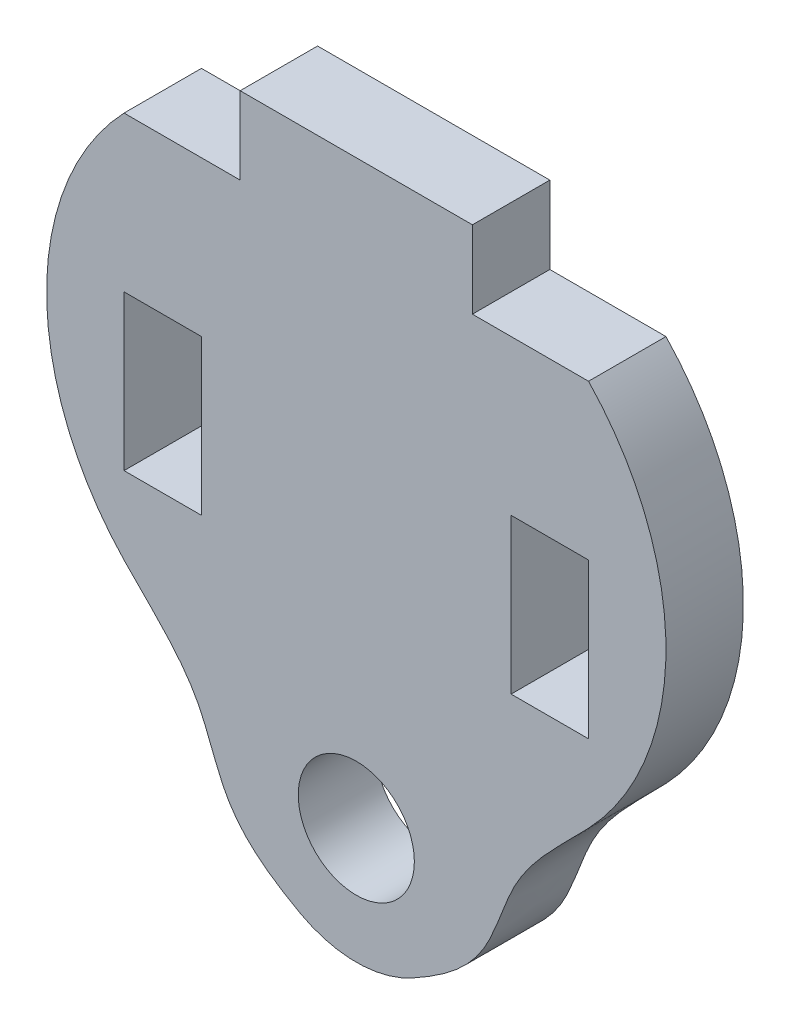
ISO-10303-21;
HEADER;
FILE_DESCRIPTION(('STEP AP214'),'2;1');
FILE_NAME('part.step','',(''),(''),'','','');
FILE_SCHEMA(('AUTOMOTIVE_DESIGN { 1 0 10303 214 1 1 1 1 }'));
ENDSEC;
DATA;
#1=APPLICATION_CONTEXT('core data for automotive mechanical design processes');
#2=APPLICATION_PROTOCOL_DEFINITION('international standard','automotive_design',2000,#1);
#3=PRODUCT_CONTEXT('',#1,'mechanical');
#4=PRODUCT('Part','Part','',(#3));
#5=PRODUCT_RELATED_PRODUCT_CATEGORY('part','',(#4));
#6=PRODUCT_DEFINITION_FORMATION('','',#4);
#7=PRODUCT_DEFINITION_CONTEXT('part definition',#1,'design');
#8=PRODUCT_DEFINITION('design','',#6,#7);
#9=PRODUCT_DEFINITION_SHAPE('','',#8);
#10=(LENGTH_UNIT() NAMED_UNIT(*) SI_UNIT(.MILLI.,.METRE.));
#11=(NAMED_UNIT(*) PLANE_ANGLE_UNIT() SI_UNIT($,.RADIAN.));
#12=(NAMED_UNIT(*) SI_UNIT($,.STERADIAN.) SOLID_ANGLE_UNIT());
#13=UNCERTAINTY_MEASURE_WITH_UNIT(LENGTH_MEASURE(1.E-05),#10,'distance_accuracy_value','');
#14=(GEOMETRIC_REPRESENTATION_CONTEXT(3) GLOBAL_UNCERTAINTY_ASSIGNED_CONTEXT((#13)) GLOBAL_UNIT_ASSIGNED_CONTEXT((#10,
#11,#12)) REPRESENTATION_CONTEXT('',''));
#15=CARTESIAN_POINT('',(0.,0.,0.));
#16=DIRECTION('',(0.,0.,1.));
#17=DIRECTION('',(1.,0.,0.));
#18=AXIS2_PLACEMENT_3D('',#15,#16,#17);
#19=CARTESIAN_POINT('',(-9.525,-7.9375,3.175));
#20=CARTESIAN_POINT('',(-8.35474372936912,-9.16626908416243,3.175));
#21=CARTESIAN_POINT('',(-6.47922950307894,-10.7577262604976,3.175));
#22=CARTESIAN_POINT('',(-5.39698970272135,-14.7718949898826,3.175));
#23=CARTESIAN_POINT('',(-3.7211253135925,-16.0861133741021,3.175));
#24=CARTESIAN_POINT('',(-2.3009215405948,-16.8697921188024,3.175));
#25=B_SPLINE_CURVE_WITH_KNOTS('',3,(#19,#20,#21,#22,#23,#24),.UNSPECIFIED.,.F.,.F.,(4,1,1,4),
(0.,0.403777480318746,0.653864754689215,1.),.UNSPECIFIED.);
#26=DIRECTION('',(0.,0.,-1.));
#27=VECTOR('',#26,1.);
#28=SURFACE_OF_LINEAR_EXTRUSION('',#25,#27);
#29=CARTESIAN_POINT('',(-9.525,-7.9375,0.));
#30=CARTESIAN_POINT('',(-8.35474372936912,-9.16626908416243,0.));
#31=CARTESIAN_POINT('',(-6.47922950307894,-10.7577262604976,0.));
#32=CARTESIAN_POINT('',(-5.39698970272135,-14.7718949898826,0.));
#33=CARTESIAN_POINT('',(-3.7211253135925,-16.0861133741021,0.));
#34=CARTESIAN_POINT('',(-2.3009215405948,-16.8697921188024,0.));
#35=B_SPLINE_CURVE_WITH_KNOTS('',3,(#29,#30,#31,#32,#33,#34),.UNSPECIFIED.,.F.,.F.,(4,1,1,4),
(0.,0.403777480318746,0.653864754689215,1.),.UNSPECIFIED.);
#36=CARTESIAN_POINT('',(-9.525,-7.9375,0.));
#37=VERTEX_POINT('',#36);
#38=CARTESIAN_POINT('',(-2.3009215405948,-16.8697921188024,0.));
#39=VERTEX_POINT('',#38);
#40=EDGE_CURVE('E218',#37,#39,#35,.T.);
#41=ORIENTED_EDGE('',*,*,#40,.T.);
#42=DIRECTION('',(0.,0.,-1.));
#43=VECTOR('',#42,1.);
#44=CARTESIAN_POINT('',(-2.3009215405948,-16.8697921188024,3.175));
#45=LINE('',#44,#43);
#46=CARTESIAN_POINT('',(-2.3009215405948,-16.8697921188024,3.175));
#47=VERTEX_POINT('',#46);
#48=EDGE_CURVE('E263',#47,#39,#45,.T.);
#49=ORIENTED_EDGE('',*,*,#48,.F.);
#50=CARTESIAN_POINT('',(-9.525,-7.9375,3.175));
#51=VERTEX_POINT('',#50);
#52=EDGE_CURVE('E219',#51,#47,#25,.T.);
#53=ORIENTED_EDGE('',*,*,#52,.F.);
#54=DIRECTION('',(0.,0.,-1.));
#55=VECTOR('',#54,1.);
#56=CARTESIAN_POINT('',(-9.525,-7.9375,3.175));
#57=LINE('',#56,#55);
#58=EDGE_CURVE('E300',#51,#37,#57,.T.);
#59=ORIENTED_EDGE('',*,*,#58,.T.);
#60=EDGE_LOOP('',(#41,#49,#53,#59));
#61=FACE_BOUND('',#60,.T.);
#62=ADVANCED_FACE('F32',(#61),#28,.F.);
#63=CARTESIAN_POINT('',(0.,-12.7,3.175));
#64=DIRECTION('',(0.,0.,-1.));
#65=DIRECTION('',(-1.,0.,0.));
#66=AXIS2_PLACEMENT_3D('',#63,#64,#65);
#67=CYLINDRICAL_SURFACE('',#66,4.76250000000001);
#68=CARTESIAN_POINT('',(0.,-12.7,0.));
#69=DIRECTION('',(0.,0.,1.));
#70=DIRECTION('',(1.,0.,0.));
#71=AXIS2_PLACEMENT_3D('',#68,#69,#70);
#72=CIRCLE('',#71,4.76250000000001);
#73=CARTESIAN_POINT('',(2.3009215405948,-16.8697921188024,0.));
#74=VERTEX_POINT('',#73);
#75=EDGE_CURVE('E259',#39,#74,#72,.T.);
#76=ORIENTED_EDGE('',*,*,#75,.T.);
#77=DIRECTION('',(0.,0.,-1.));
#78=VECTOR('',#77,1.);
#79=CARTESIAN_POINT('',(2.3009215405948,-16.8697921188024,3.175));
#80=LINE('',#79,#78);
#81=CARTESIAN_POINT('',(2.3009215405948,-16.8697921188024,3.175));
#82=VERTEX_POINT('',#81);
#83=EDGE_CURVE('E261',#82,#74,#80,.T.);
#84=ORIENTED_EDGE('',*,*,#83,.F.);
#85=CARTESIAN_POINT('',(0.,-12.7,3.175));
#86=DIRECTION('',(0.,0.,1.));
#87=DIRECTION('',(1.,0.,0.));
#88=AXIS2_PLACEMENT_3D('',#85,#86,#87);
#89=CIRCLE('',#88,4.76250000000001);
#90=EDGE_CURVE('E225',#47,#82,#89,.T.);
#91=ORIENTED_EDGE('',*,*,#90,.F.);
#92=ORIENTED_EDGE('',*,*,#48,.T.);
#93=EDGE_LOOP('',(#76,#84,#91,#92));
#94=FACE_BOUND('',#93,.T.);
#95=ADVANCED_FACE('F247',(#94),#67,.T.);
#96=CARTESIAN_POINT('',(9.525,-7.9375,3.175));
#97=CARTESIAN_POINT('',(8.35474372936912,-9.16626908416242,3.175));
#98=CARTESIAN_POINT('',(6.47922950307894,-10.7577262604976,3.175));
#99=CARTESIAN_POINT('',(5.39698970272135,-14.7718949898826,3.175));
#100=CARTESIAN_POINT('',(3.7211253135925,-16.0861133741021,3.175));
#101=CARTESIAN_POINT('',(2.3009215405948,-16.8697921188024,3.175));
#102=B_SPLINE_CURVE_WITH_KNOTS('',3,(#96,#97,#98,#99,#100,#101),.UNSPECIFIED.,.F.,.F.,(4,1,1,4),
(0.,0.403777480318746,0.653864754689215,1.),.UNSPECIFIED.);
#103=DIRECTION('',(0.,0.,-1.));
#104=VECTOR('',#103,1.);
#105=SURFACE_OF_LINEAR_EXTRUSION('',#102,#104);
#106=CARTESIAN_POINT('',(9.525,-7.9375,0.));
#107=CARTESIAN_POINT('',(8.35474372936912,-9.16626908416242,0.));
#108=CARTESIAN_POINT('',(6.47922950307894,-10.7577262604976,0.));
#109=CARTESIAN_POINT('',(5.39698970272135,-14.7718949898826,0.));
#110=CARTESIAN_POINT('',(3.7211253135925,-16.0861133741021,0.));
#111=CARTESIAN_POINT('',(2.3009215405948,-16.8697921188024,0.));
#112=B_SPLINE_CURVE_WITH_KNOTS('',3,(#106,#107,#108,#109,#110,#111),.UNSPECIFIED.,.F.,.F.,(4,1,
1,4),(0.,0.403777480318746,0.653864754689215,1.),.UNSPECIFIED.);
#113=CARTESIAN_POINT('',(9.525,-7.9375,0.));
#114=VERTEX_POINT('',#113);
#115=EDGE_CURVE('E267',#114,#74,#112,.T.);
#116=ORIENTED_EDGE('',*,*,#115,.F.);
#117=DIRECTION('',(0.,0.,-1.));
#118=VECTOR('',#117,1.);
#119=CARTESIAN_POINT('',(9.525,-7.9375,3.175));
#120=LINE('',#119,#118);
#121=CARTESIAN_POINT('',(9.525,-7.9375,3.175));
#122=VERTEX_POINT('',#121);
#123=EDGE_CURVE('E318',#122,#114,#120,.T.);
#124=ORIENTED_EDGE('',*,*,#123,.F.);
#125=EDGE_CURVE('E231',#122,#82,#102,.T.);
#126=ORIENTED_EDGE('',*,*,#125,.T.);
#127=ORIENTED_EDGE('',*,*,#83,.T.);
#128=EDGE_LOOP('',(#116,#124,#126,#127));
#129=FACE_BOUND('',#128,.T.);
#130=ADVANCED_FACE('F243',(#129),#105,.T.);
#131=CARTESIAN_POINT('',(1.190625,0.,3.175));
#132=DIRECTION('',(0.,0.,-1.));
#133=DIRECTION('',(-1.,0.,0.));
#134=AXIS2_PLACEMENT_3D('',#131,#132,#133);
#135=CYLINDRICAL_SURFACE('',#134,11.509375);
#136=CARTESIAN_POINT('',(1.190625,0.,0.));
#137=DIRECTION('',(0.,0.,1.));
#138=DIRECTION('',(1.,0.,0.));
#139=AXIS2_PLACEMENT_3D('',#136,#137,#138);
#140=CIRCLE('',#139,11.509375);
#141=CARTESIAN_POINT('',(9.525,7.9375,0.));
#142=VERTEX_POINT('',#141);
#143=EDGE_CURVE('E274',#142,#114,#140,.F.);
#144=ORIENTED_EDGE('',*,*,#143,.F.);
#145=DIRECTION('',(0.,0.,-1.));
#146=VECTOR('',#145,1.);
#147=CARTESIAN_POINT('',(9.525,7.9375,3.175));
#148=LINE('',#147,#146);
#149=CARTESIAN_POINT('',(9.525,7.9375,3.175));
#150=VERTEX_POINT('',#149);
#151=EDGE_CURVE('E316',#150,#142,#148,.T.);
#152=ORIENTED_EDGE('',*,*,#151,.F.);
#153=CARTESIAN_POINT('',(1.190625,0.,3.175));
#154=DIRECTION('',(0.,0.,1.));
#155=DIRECTION('',(1.,0.,0.));
#156=AXIS2_PLACEMENT_3D('',#153,#154,#155);
#157=CIRCLE('',#156,11.509375);
#158=EDGE_CURVE('E237',#150,#122,#157,.F.);
#159=ORIENTED_EDGE('',*,*,#158,.T.);
#160=ORIENTED_EDGE('',*,*,#123,.T.);
#161=EDGE_LOOP('',(#144,#152,#159,#160));
#162=FACE_BOUND('',#161,.T.);
#163=ADVANCED_FACE('F246',(#162),#135,.T.);
#164=CARTESIAN_POINT('',(0.,7.9375,3.175));
#165=DIRECTION('',(0.,-1.,0.));
#166=DIRECTION('',(1.,0.,0.));
#167=AXIS2_PLACEMENT_3D('',#164,#165,#166);
#168=PLANE('',#167);
#169=DIRECTION('',(-1.,0.,0.));
#170=VECTOR('',#169,1.);
#171=CARTESIAN_POINT('',(0.,7.9375,0.));
#172=LINE('',#171,#170);
#173=CARTESIAN_POINT('',(4.7625,7.9375,0.));
#174=VERTEX_POINT('',#173);
#175=EDGE_CURVE('E276',#142,#174,#172,.T.);
#176=ORIENTED_EDGE('',*,*,#175,.T.);
#177=DIRECTION('',(0.,0.,-1.));
#178=VECTOR('',#177,1.);
#179=CARTESIAN_POINT('',(4.7625,7.9375,3.175));
#180=LINE('',#179,#178);
#181=CARTESIAN_POINT('',(4.7625,7.9375,3.175));
#182=VERTEX_POINT('',#181);
#183=EDGE_CURVE('E313',#182,#174,#180,.T.);
#184=ORIENTED_EDGE('',*,*,#183,.F.);
#185=DIRECTION('',(-1.,0.,0.));
#186=VECTOR('',#185,1.);
#187=CARTESIAN_POINT('',(0.,7.9375,3.175));
#188=LINE('',#187,#186);
#189=EDGE_CURVE('E406',#150,#182,#188,.T.);
#190=ORIENTED_EDGE('',*,*,#189,.F.);
#191=ORIENTED_EDGE('',*,*,#151,.T.);
#192=EDGE_LOOP('',(#176,#184,#190,#191));
#193=FACE_BOUND('',#192,.T.);
#194=ADVANCED_FACE('F374',(#193),#168,.F.);
#195=CARTESIAN_POINT('',(4.7625,0.,3.175));
#196=DIRECTION('',(-1.,0.,0.));
#197=DIRECTION('',(0.,0.,1.));
#198=AXIS2_PLACEMENT_3D('',#195,#196,#197);
#199=PLANE('',#198);
#200=DIRECTION('',(0.,1.,0.));
#201=VECTOR('',#200,1.);
#202=CARTESIAN_POINT('',(4.7625,0.,0.));
#203=LINE('',#202,#201);
#204=CARTESIAN_POINT('',(4.7625,11.1125,0.));
#205=VERTEX_POINT('',#204);
#206=EDGE_CURVE('E286',#174,#205,#203,.T.);
#207=ORIENTED_EDGE('',*,*,#206,.T.);
#208=DIRECTION('',(0.,0.,-1.));
#209=VECTOR('',#208,1.);
#210=CARTESIAN_POINT('',(4.7625,11.1125,3.175));
#211=LINE('',#210,#209);
#212=CARTESIAN_POINT('',(4.7625,11.1125,3.175));
#213=VERTEX_POINT('',#212);
#214=EDGE_CURVE('E311',#213,#205,#211,.T.);
#215=ORIENTED_EDGE('',*,*,#214,.F.);
#216=DIRECTION('',(0.,1.,0.));
#217=VECTOR('',#216,1.);
#218=CARTESIAN_POINT('',(4.7625,0.,3.175));
#219=LINE('',#218,#217);
#220=EDGE_CURVE('E402',#182,#213,#219,.T.);
#221=ORIENTED_EDGE('',*,*,#220,.F.);
#222=ORIENTED_EDGE('',*,*,#183,.T.);
#223=EDGE_LOOP('',(#207,#215,#221,#222));
#224=FACE_BOUND('',#223,.T.);
#225=ADVANCED_FACE('F380',(#224),#199,.F.);
#226=CARTESIAN_POINT('',(0.,11.1125,3.175));
#227=DIRECTION('',(0.,1.,0.));
#228=DIRECTION('',(-1.,0.,0.));
#229=AXIS2_PLACEMENT_3D('',#226,#227,#228);
#230=PLANE('',#229);
#231=DIRECTION('',(1.,0.,0.));
#232=VECTOR('',#231,1.);
#233=CARTESIAN_POINT('',(0.,11.1125,0.));
#234=LINE('',#233,#232);
#235=CARTESIAN_POINT('',(-4.7625,11.1125,0.));
#236=VERTEX_POINT('',#235);
#237=EDGE_CURVE('E290',#236,#205,#234,.T.);
#238=ORIENTED_EDGE('',*,*,#237,.F.);
#239=DIRECTION('',(0.,0.,-1.));
#240=VECTOR('',#239,1.);
#241=CARTESIAN_POINT('',(-4.7625,11.1125,3.175));
#242=LINE('',#241,#240);
#243=CARTESIAN_POINT('',(-4.7625,11.1125,3.175));
#244=VERTEX_POINT('',#243);
#245=EDGE_CURVE('E309',#244,#236,#242,.T.);
#246=ORIENTED_EDGE('',*,*,#245,.F.);
#247=DIRECTION('',(1.,0.,0.));
#248=VECTOR('',#247,1.);
#249=CARTESIAN_POINT('',(0.,11.1125,3.175));
#250=LINE('',#249,#248);
#251=EDGE_CURVE('E397',#244,#213,#250,.T.);
#252=ORIENTED_EDGE('',*,*,#251,.T.);
#253=ORIENTED_EDGE('',*,*,#214,.T.);
#254=EDGE_LOOP('',(#238,#246,#252,#253));
#255=FACE_BOUND('',#254,.T.);
#256=ADVANCED_FACE('F377',(#255),#230,.T.);
#257=CARTESIAN_POINT('',(-4.7625,0.,3.175));
#258=DIRECTION('',(-1.,0.,0.));
#259=DIRECTION('',(0.,0.,1.));
#260=AXIS2_PLACEMENT_3D('',#257,#258,#259);
#261=PLANE('',#260);
#262=DIRECTION('',(0.,1.,0.));
#263=VECTOR('',#262,1.);
#264=CARTESIAN_POINT('',(-4.7625,0.,0.));
#265=LINE('',#264,#263);
#266=CARTESIAN_POINT('',(-4.7625,7.9375,0.));
#267=VERTEX_POINT('',#266);
#268=EDGE_CURVE('E293',#267,#236,#265,.T.);
#269=ORIENTED_EDGE('',*,*,#268,.F.);
#270=DIRECTION('',(0.,0.,-1.));
#271=VECTOR('',#270,1.);
#272=CARTESIAN_POINT('',(-4.7625,7.9375,3.175));
#273=LINE('',#272,#271);
#274=CARTESIAN_POINT('',(-4.7625,7.9375,3.175));
#275=VERTEX_POINT('',#274);
#276=EDGE_CURVE('E307',#275,#267,#273,.T.);
#277=ORIENTED_EDGE('',*,*,#276,.F.);
#278=DIRECTION('',(0.,1.,0.));
#279=VECTOR('',#278,1.);
#280=CARTESIAN_POINT('',(-4.7625,0.,3.175));
#281=LINE('',#280,#279);
#282=EDGE_CURVE('E401',#275,#244,#281,.T.);
#283=ORIENTED_EDGE('',*,*,#282,.T.);
#284=ORIENTED_EDGE('',*,*,#245,.T.);
#285=EDGE_LOOP('',(#269,#277,#283,#284));
#286=FACE_BOUND('',#285,.T.);
#287=ADVANCED_FACE('F372',(#286),#261,.T.);
#288=CARTESIAN_POINT('',(-9.525,7.9375,0.));
#289=VERTEX_POINT('',#288);
#290=EDGE_CURVE('E287',#267,#289,#172,.T.);
#291=ORIENTED_EDGE('',*,*,#290,.T.);
#292=DIRECTION('',(0.,0.,-1.));
#293=VECTOR('',#292,1.);
#294=CARTESIAN_POINT('',(-9.525,7.9375,3.175));
#295=LINE('',#294,#293);
#296=CARTESIAN_POINT('',(-9.525,7.9375,3.175));
#297=VERTEX_POINT('',#296);
#298=EDGE_CURVE('E303',#297,#289,#295,.T.);
#299=ORIENTED_EDGE('',*,*,#298,.F.);
#300=EDGE_CURVE('E404',#275,#297,#188,.T.);
#301=ORIENTED_EDGE('',*,*,#300,.F.);
#302=ORIENTED_EDGE('',*,*,#276,.T.);
#303=EDGE_LOOP('',(#291,#299,#301,#302));
#304=FACE_BOUND('',#303,.T.);
#305=ADVANCED_FACE('F368',(#304),#168,.F.);
#306=CARTESIAN_POINT('',(-1.19062499999999,0.,3.175));
#307=DIRECTION('',(0.,0.,-1.));
#308=DIRECTION('',(-1.,0.,0.));
#309=AXIS2_PLACEMENT_3D('',#306,#307,#308);
#310=CYLINDRICAL_SURFACE('',#309,11.509375);
#311=CARTESIAN_POINT('',(-1.19062499999999,0.,0.));
#312=DIRECTION('',(0.,0.,1.));
#313=DIRECTION('',(1.,0.,0.));
#314=AXIS2_PLACEMENT_3D('',#311,#312,#313);
#315=CIRCLE('',#314,11.509375);
#316=EDGE_CURVE('E296',#289,#37,#315,.T.);
#317=ORIENTED_EDGE('',*,*,#316,.T.);
#318=ORIENTED_EDGE('',*,*,#58,.F.);
#319=CARTESIAN_POINT('',(-1.19062499999999,0.,3.175));
#320=DIRECTION('',(0.,0.,1.));
#321=DIRECTION('',(1.,0.,0.));
#322=AXIS2_PLACEMENT_3D('',#319,#320,#321);
#323=CIRCLE('',#322,11.509375);
#324=EDGE_CURVE('E409',#297,#51,#323,.T.);
#325=ORIENTED_EDGE('',*,*,#324,.F.);
#326=ORIENTED_EDGE('',*,*,#298,.T.);
#327=EDGE_LOOP('',(#317,#318,#325,#326));
#328=FACE_BOUND('',#327,.T.);
#329=ADVANCED_FACE('F364',(#328),#310,.T.);
#330=CARTESIAN_POINT('',(0.,-12.7,3.175));
#331=DIRECTION('',(0.,0.,-1.));
#332=DIRECTION('',(-1.,0.,0.));
#333=AXIS2_PLACEMENT_3D('',#330,#331,#332);
#334=CYLINDRICAL_SURFACE('',#333,2.38125);
#335=CARTESIAN_POINT('',(0.,-12.7,3.175));
#336=DIRECTION('',(0.,0.,1.));
#337=DIRECTION('',(1.,0.,0.));
#338=AXIS2_PLACEMENT_3D('',#335,#336,#337);
#339=CIRCLE('',#338,2.38125);
#340=CARTESIAN_POINT('',(2.38125,-12.7,3.175));
#341=VERTEX_POINT('',#340);
#342=EDGE_CURVE('E304',#341,#341,#339,.T.);
#343=ORIENTED_EDGE('',*,*,#342,.T.);
#344=EDGE_LOOP('',(#343));
#345=FACE_BOUND('',#344,.T.);
#346=CARTESIAN_POINT('',(0.,-12.7,0.));
#347=DIRECTION('',(0.,0.,1.));
#348=DIRECTION('',(1.,0.,0.));
#349=AXIS2_PLACEMENT_3D('',#346,#347,#348);
#350=CIRCLE('',#349,2.38125);
#351=CARTESIAN_POINT('',(2.38125,-12.7,0.));
#352=VERTEX_POINT('',#351);
#353=EDGE_CURVE('E226',#352,#352,#350,.T.);
#354=ORIENTED_EDGE('',*,*,#353,.F.);
#355=EDGE_LOOP('',(#354));
#356=FACE_BOUND('',#355,.T.);
#357=ADVANCED_FACE('F358',(#345,#356),#334,.F.);
#358=CARTESIAN_POINT('',(0.,0.,3.175));
#359=DIRECTION('',(0.,0.,1.));
#360=DIRECTION('',(1.,0.,0.));
#361=AXIS2_PLACEMENT_3D('',#358,#359,#360);
#362=PLANE('',#361);
#363=DIRECTION('',(0.,-1.,0.));
#364=VECTOR('',#363,1.);
#365=CARTESIAN_POINT('',(6.34999999999998,0.,3.175));
#366=LINE('',#365,#364);
#367=CARTESIAN_POINT('',(6.34999999999998,1.58750000000001,3.17499999999998));
#368=VERTEX_POINT('',#367);
#369=CARTESIAN_POINT('',(6.34999999999998,-4.76249999999999,3.17499999999998));
#370=VERTEX_POINT('',#369);
#371=EDGE_CURVE('E171',#368,#370,#366,.T.);
#372=ORIENTED_EDGE('',*,*,#371,.F.);
#373=DIRECTION('',(1.,0.,0.));
#374=VECTOR('',#373,1.);
#375=CARTESIAN_POINT('',(6.34999999999998,1.58750000000001,3.17499999999998));
#376=LINE('',#375,#374);
#377=CARTESIAN_POINT('',(9.52499999999998,1.58750000000001,3.17499999999998));
#378=VERTEX_POINT('',#377);
#379=EDGE_CURVE('E179',#368,#378,#376,.T.);
#380=ORIENTED_EDGE('',*,*,#379,.T.);
#381=DIRECTION('',(0.,-1.,0.));
#382=VECTOR('',#381,1.);
#383=CARTESIAN_POINT('',(9.52499999999998,0.,3.175));
#384=LINE('',#383,#382);
#385=CARTESIAN_POINT('',(9.52499999999998,-4.76249999999999,3.175));
#386=VERTEX_POINT('',#385);
#387=EDGE_CURVE('E163',#378,#386,#384,.T.);
#388=ORIENTED_EDGE('',*,*,#387,.T.);
#389=DIRECTION('',(1.,0.,0.));
#390=VECTOR('',#389,1.);
#391=CARTESIAN_POINT('',(6.34999999999998,-4.76249999999999,3.17499999999998));
#392=LINE('',#391,#390);
#393=EDGE_CURVE('E164',#370,#386,#392,.T.);
#394=ORIENTED_EDGE('',*,*,#393,.F.);
#395=EDGE_LOOP('',(#372,#380,#388,#394));
#396=FACE_BOUND('',#395,.T.);
#397=DIRECTION('',(0.,-1.,0.));
#398=VECTOR('',#397,1.);
#399=CARTESIAN_POINT('',(-9.52500000000001,0.,3.175));
#400=LINE('',#399,#398);
#401=CARTESIAN_POINT('',(-9.52500000000001,1.58750000000003,3.17499999999999));
#402=VERTEX_POINT('',#401);
#403=CARTESIAN_POINT('',(-9.52500000000001,-4.76249999999997,3.17499999999999));
#404=VERTEX_POINT('',#403);
#405=EDGE_CURVE('E217',#402,#404,#400,.T.);
#406=ORIENTED_EDGE('',*,*,#405,.F.);
#407=DIRECTION('',(1.,0.,0.));
#408=VECTOR('',#407,1.);
#409=CARTESIAN_POINT('',(-9.52500000000001,1.58750000000003,3.17499999999999));
#410=LINE('',#409,#408);
#411=CARTESIAN_POINT('',(-6.35000000000001,1.58750000000003,3.17499999999999));
#412=VERTEX_POINT('',#411);
#413=EDGE_CURVE('E205',#402,#412,#410,.T.);
#414=ORIENTED_EDGE('',*,*,#413,.T.);
#415=DIRECTION('',(0.,-1.,0.));
#416=VECTOR('',#415,1.);
#417=CARTESIAN_POINT('',(-6.35000000000001,0.,3.175));
#418=LINE('',#417,#416);
#419=CARTESIAN_POINT('',(-6.35000000000001,-4.76249999999997,3.175));
#420=VERTEX_POINT('',#419);
#421=EDGE_CURVE('E214',#412,#420,#418,.T.);
#422=ORIENTED_EDGE('',*,*,#421,.T.);
#423=DIRECTION('',(1.,0.,0.));
#424=VECTOR('',#423,1.);
#425=CARTESIAN_POINT('',(-9.52500000000001,-4.76249999999997,3.17499999999999));
#426=LINE('',#425,#424);
#427=EDGE_CURVE('E208',#404,#420,#426,.T.);
#428=ORIENTED_EDGE('',*,*,#427,.F.);
#429=EDGE_LOOP('',(#406,#414,#422,#428));
#430=FACE_BOUND('',#429,.T.);
#431=ORIENTED_EDGE('',*,*,#52,.T.);
#432=ORIENTED_EDGE('',*,*,#90,.T.);
#433=ORIENTED_EDGE('',*,*,#125,.F.);
#434=ORIENTED_EDGE('',*,*,#158,.F.);
#435=ORIENTED_EDGE('',*,*,#189,.T.);
#436=ORIENTED_EDGE('',*,*,#220,.T.);
#437=ORIENTED_EDGE('',*,*,#251,.F.);
#438=ORIENTED_EDGE('',*,*,#282,.F.);
#439=ORIENTED_EDGE('',*,*,#300,.T.);
#440=ORIENTED_EDGE('',*,*,#324,.T.);
#441=EDGE_LOOP('',(#431,#432,#433,#434,#435,#436,#437,#438,#439,#440));
#442=FACE_BOUND('',#441,.T.);
#443=ORIENTED_EDGE('',*,*,#342,.F.);
#444=EDGE_LOOP('',(#443));
#445=FACE_BOUND('',#444,.T.);
#446=ADVANCED_FACE('F355',(#396,#430,#442,#445),#362,.T.);
#447=CARTESIAN_POINT('',(0.,0.,0.));
#448=DIRECTION('',(0.,0.,1.));
#449=DIRECTION('',(1.,0.,0.));
#450=AXIS2_PLACEMENT_3D('',#447,#448,#449);
#451=PLANE('',#450);
#452=DIRECTION('',(1.,0.,0.));
#453=VECTOR('',#452,1.);
#454=CARTESIAN_POINT('',(6.34999999999998,1.58750000000001,0.));
#455=LINE('',#454,#453);
#456=CARTESIAN_POINT('',(6.34999999999998,1.58750000000001,0.));
#457=VERTEX_POINT('',#456);
#458=CARTESIAN_POINT('',(9.52499999999998,1.58750000000001,0.));
#459=VERTEX_POINT('',#458);
#460=EDGE_CURVE('E177',#457,#459,#455,.T.);
#461=ORIENTED_EDGE('',*,*,#460,.F.);
#462=DIRECTION('',(0.,-1.,0.));
#463=VECTOR('',#462,1.);
#464=CARTESIAN_POINT('',(6.34999999999998,0.,0.));
#465=LINE('',#464,#463);
#466=CARTESIAN_POINT('',(6.34999999999998,-4.76249999999999,0.));
#467=VERTEX_POINT('',#466);
#468=EDGE_CURVE('E11',#457,#467,#465,.T.);
#469=ORIENTED_EDGE('',*,*,#468,.T.);
#470=DIRECTION('',(1.,0.,0.));
#471=VECTOR('',#470,1.);
#472=CARTESIAN_POINT('',(6.34999999999998,-4.76249999999999,0.));
#473=LINE('',#472,#471);
#474=CARTESIAN_POINT('',(9.52499999999998,-4.76249999999999,0.));
#475=VERTEX_POINT('',#474);
#476=EDGE_CURVE('E156',#467,#475,#473,.T.);
#477=ORIENTED_EDGE('',*,*,#476,.T.);
#478=DIRECTION('',(0.,-1.,0.));
#479=VECTOR('',#478,1.);
#480=CARTESIAN_POINT('',(9.52499999999998,0.,0.));
#481=LINE('',#480,#479);
#482=EDGE_CURVE('E40',#459,#475,#481,.T.);
#483=ORIENTED_EDGE('',*,*,#482,.F.);
#484=EDGE_LOOP('',(#461,#469,#477,#483));
#485=FACE_BOUND('',#484,.T.);
#486=DIRECTION('',(1.,0.,0.));
#487=VECTOR('',#486,1.);
#488=CARTESIAN_POINT('',(-9.52500000000001,1.58750000000003,0.));
#489=LINE('',#488,#487);
#490=CARTESIAN_POINT('',(-9.52500000000001,1.58750000000003,0.));
#491=VERTEX_POINT('',#490);
#492=CARTESIAN_POINT('',(-6.35000000000001,1.58750000000003,0.));
#493=VERTEX_POINT('',#492);
#494=EDGE_CURVE('E199',#491,#493,#489,.T.);
#495=ORIENTED_EDGE('',*,*,#494,.F.);
#496=DIRECTION('',(0.,-1.,0.));
#497=VECTOR('',#496,1.);
#498=CARTESIAN_POINT('',(-9.52500000000001,0.,0.));
#499=LINE('',#498,#497);
#500=CARTESIAN_POINT('',(-9.52500000000001,-4.76249999999997,0.));
#501=VERTEX_POINT('',#500);
#502=EDGE_CURVE('E324',#491,#501,#499,.T.);
#503=ORIENTED_EDGE('',*,*,#502,.T.);
#504=DIRECTION('',(1.,0.,0.));
#505=VECTOR('',#504,1.);
#506=CARTESIAN_POINT('',(-9.52500000000001,-4.76249999999997,0.));
#507=LINE('',#506,#505);
#508=CARTESIAN_POINT('',(-6.35000000000001,-4.76249999999997,0.));
#509=VERTEX_POINT('',#508);
#510=EDGE_CURVE('E211',#501,#509,#507,.T.);
#511=ORIENTED_EDGE('',*,*,#510,.T.);
#512=DIRECTION('',(0.,-1.,0.));
#513=VECTOR('',#512,1.);
#514=CARTESIAN_POINT('',(-6.35000000000001,0.,0.));
#515=LINE('',#514,#513);
#516=EDGE_CURVE('E322',#493,#509,#515,.T.);
#517=ORIENTED_EDGE('',*,*,#516,.F.);
#518=EDGE_LOOP('',(#495,#503,#511,#517));
#519=FACE_BOUND('',#518,.T.);
#520=ORIENTED_EDGE('',*,*,#40,.F.);
#521=ORIENTED_EDGE('',*,*,#316,.F.);
#522=ORIENTED_EDGE('',*,*,#290,.F.);
#523=ORIENTED_EDGE('',*,*,#268,.T.);
#524=ORIENTED_EDGE('',*,*,#237,.T.);
#525=ORIENTED_EDGE('',*,*,#206,.F.);
#526=ORIENTED_EDGE('',*,*,#175,.F.);
#527=ORIENTED_EDGE('',*,*,#143,.T.);
#528=ORIENTED_EDGE('',*,*,#115,.T.);
#529=ORIENTED_EDGE('',*,*,#75,.F.);
#530=EDGE_LOOP('',(#520,#521,#522,#523,#524,#525,#526,#527,#528,#529));
#531=FACE_BOUND('',#530,.T.);
#532=ORIENTED_EDGE('',*,*,#353,.T.);
#533=EDGE_LOOP('',(#532));
#534=FACE_BOUND('',#533,.T.);
#535=ADVANCED_FACE('F175',(#485,#519,#531,#534),#451,.F.);
#536=CARTESIAN_POINT('',(-9.52500000000001,-1.58749999999997,-9.52500000000001));
#537=DIRECTION('',(-1.,0.,0.));
#538=DIRECTION('',(0.,-1.,0.));
#539=AXIS2_PLACEMENT_3D('',#536,#537,#538);
#540=PLANE('',#539);
#541=ORIENTED_EDGE('',*,*,#405,.T.);
#542=DIRECTION('',(0.,0.,1.));
#543=VECTOR('',#542,1.);
#544=CARTESIAN_POINT('',(-9.52500000000001,-4.76249999999997,-9.52500000000001));
#545=LINE('',#544,#543);
#546=EDGE_CURVE('E192',#501,#404,#545,.T.);
#547=ORIENTED_EDGE('',*,*,#546,.F.);
#548=ORIENTED_EDGE('',*,*,#502,.F.);
#549=DIRECTION('',(0.,0.,1.));
#550=VECTOR('',#549,1.);
#551=CARTESIAN_POINT('',(-9.52500000000001,1.58750000000003,-9.52500000000001));
#552=LINE('',#551,#550);
#553=EDGE_CURVE('E195',#491,#402,#552,.T.);
#554=ORIENTED_EDGE('',*,*,#553,.T.);
#555=EDGE_LOOP('',(#541,#547,#548,#554));
#556=FACE_BOUND('',#555,.T.);
#557=ADVANCED_FACE('F340',(#556),#540,.F.);
#558=CARTESIAN_POINT('',(-6.35000000000001,-1.58749999999997,-9.52500000000001));
#559=DIRECTION('',(-1.,0.,0.));
#560=DIRECTION('',(0.,-1.,0.));
#561=AXIS2_PLACEMENT_3D('',#558,#559,#560);
#562=PLANE('',#561);
#563=DIRECTION('',(0.,0.,1.));
#564=VECTOR('',#563,1.);
#565=CARTESIAN_POINT('',(-6.35000000000001,1.58750000000003,-9.52500000000001));
#566=LINE('',#565,#564);
#567=EDGE_CURVE('E196',#493,#412,#566,.T.);
#568=ORIENTED_EDGE('',*,*,#567,.F.);
#569=ORIENTED_EDGE('',*,*,#516,.T.);
#570=DIRECTION('',(0.,0.,1.));
#571=VECTOR('',#570,1.);
#572=CARTESIAN_POINT('',(-6.35000000000001,-4.76249999999997,-9.52500000000001));
#573=LINE('',#572,#571);
#574=EDGE_CURVE('E191',#509,#420,#573,.T.);
#575=ORIENTED_EDGE('',*,*,#574,.T.);
#576=ORIENTED_EDGE('',*,*,#421,.F.);
#577=EDGE_LOOP('',(#568,#569,#575,#576));
#578=FACE_BOUND('',#577,.T.);
#579=ADVANCED_FACE('F343',(#578),#562,.T.);
#580=CARTESIAN_POINT('',(-9.52500000000001,-4.76249999999997,-9.52500000000001));
#581=DIRECTION('',(0.,1.,0.));
#582=DIRECTION('',(-1.,0.,0.));
#583=AXIS2_PLACEMENT_3D('',#580,#581,#582);
#584=PLANE('',#583);
#585=ORIENTED_EDGE('',*,*,#574,.F.);
#586=ORIENTED_EDGE('',*,*,#510,.F.);
#587=ORIENTED_EDGE('',*,*,#546,.T.);
#588=ORIENTED_EDGE('',*,*,#427,.T.);
#589=EDGE_LOOP('',(#585,#586,#587,#588));
#590=FACE_BOUND('',#589,.T.);
#591=ADVANCED_FACE('F347',(#590),#584,.T.);
#592=CARTESIAN_POINT('',(-9.52500000000001,1.58750000000003,-9.52500000000001));
#593=DIRECTION('',(0.,1.,0.));
#594=DIRECTION('',(-1.,0.,0.));
#595=AXIS2_PLACEMENT_3D('',#592,#593,#594);
#596=PLANE('',#595);
#597=ORIENTED_EDGE('',*,*,#567,.T.);
#598=ORIENTED_EDGE('',*,*,#413,.F.);
#599=ORIENTED_EDGE('',*,*,#553,.F.);
#600=ORIENTED_EDGE('',*,*,#494,.T.);
#601=EDGE_LOOP('',(#597,#598,#599,#600));
#602=FACE_BOUND('',#601,.T.);
#603=ADVANCED_FACE('F335',(#602),#596,.F.);
#604=CARTESIAN_POINT('',(6.34999999999998,-1.58749999999999,-9.52500000000002));
#605=DIRECTION('',(-1.,0.,0.));
#606=DIRECTION('',(0.,-1.,0.));
#607=AXIS2_PLACEMENT_3D('',#604,#605,#606);
#608=PLANE('',#607);
#609=ORIENTED_EDGE('',*,*,#371,.T.);
#610=DIRECTION('',(0.,0.,1.));
#611=VECTOR('',#610,1.);
#612=CARTESIAN_POINT('',(6.34999999999998,-4.76249999999999,-9.52500000000002));
#613=LINE('',#612,#611);
#614=EDGE_CURVE('E159',#467,#370,#613,.T.);
#615=ORIENTED_EDGE('',*,*,#614,.F.);
#616=ORIENTED_EDGE('',*,*,#468,.F.);
#617=DIRECTION('',(0.,0.,1.));
#618=VECTOR('',#617,1.);
#619=CARTESIAN_POINT('',(6.34999999999998,1.58750000000001,-9.52500000000002));
#620=LINE('',#619,#618);
#621=EDGE_CURVE('E172',#457,#368,#620,.T.);
#622=ORIENTED_EDGE('',*,*,#621,.T.);
#623=EDGE_LOOP('',(#609,#615,#616,#622));
#624=FACE_BOUND('',#623,.T.);
#625=ADVANCED_FACE('F167',(#624),#608,.F.);
#626=CARTESIAN_POINT('',(9.52499999999998,-1.58749999999998,-9.52500000000002));
#627=DIRECTION('',(-1.,0.,0.));
#628=DIRECTION('',(0.,-1.,0.));
#629=AXIS2_PLACEMENT_3D('',#626,#627,#628);
#630=PLANE('',#629);
#631=DIRECTION('',(0.,0.,1.));
#632=VECTOR('',#631,1.);
#633=CARTESIAN_POINT('',(9.52499999999998,1.58750000000001,-9.52500000000002));
#634=LINE('',#633,#632);
#635=EDGE_CURVE('E52',#459,#378,#634,.T.);
#636=ORIENTED_EDGE('',*,*,#635,.F.);
#637=ORIENTED_EDGE('',*,*,#482,.T.);
#638=DIRECTION('',(0.,0.,1.));
#639=VECTOR('',#638,1.);
#640=CARTESIAN_POINT('',(9.52499999999998,-4.76249999999999,-9.52500000000002));
#641=LINE('',#640,#639);
#642=EDGE_CURVE('E47',#475,#386,#641,.T.);
#643=ORIENTED_EDGE('',*,*,#642,.T.);
#644=ORIENTED_EDGE('',*,*,#387,.F.);
#645=EDGE_LOOP('',(#636,#637,#643,#644));
#646=FACE_BOUND('',#645,.T.);
#647=ADVANCED_FACE('F326',(#646),#630,.T.);
#648=CARTESIAN_POINT('',(6.34999999999998,-4.76249999999999,-9.52500000000002));
#649=DIRECTION('',(0.,1.,0.));
#650=DIRECTION('',(-1.,0.,0.));
#651=AXIS2_PLACEMENT_3D('',#648,#649,#650);
#652=PLANE('',#651);
#653=ORIENTED_EDGE('',*,*,#642,.F.);
#654=ORIENTED_EDGE('',*,*,#476,.F.);
#655=ORIENTED_EDGE('',*,*,#614,.T.);
#656=ORIENTED_EDGE('',*,*,#393,.T.);
#657=EDGE_LOOP('',(#653,#654,#655,#656));
#658=FACE_BOUND('',#657,.T.);
#659=ADVANCED_FACE('F158',(#658),#652,.T.);
#660=CARTESIAN_POINT('',(6.34999999999998,1.58750000000001,-9.52500000000002));
#661=DIRECTION('',(0.,1.,0.));
#662=DIRECTION('',(-1.,0.,0.));
#663=AXIS2_PLACEMENT_3D('',#660,#661,#662);
#664=PLANE('',#663);
#665=ORIENTED_EDGE('',*,*,#635,.T.);
#666=ORIENTED_EDGE('',*,*,#379,.F.);
#667=ORIENTED_EDGE('',*,*,#621,.F.);
#668=ORIENTED_EDGE('',*,*,#460,.T.);
#669=EDGE_LOOP('',(#665,#666,#667,#668));
#670=FACE_BOUND('',#669,.T.);
#671=ADVANCED_FACE('F333',(#670),#664,.F.);
#672=CLOSED_SHELL('',(#62,#95,#130,#163,#194,#225,#256,#287,#305,#329,#357,#446,#535,#557,#579,
#591,#603,#625,#647,#659,#671));
#673=MANIFOLD_SOLID_BREP('B2',#672);
#674=ADVANCED_BREP_SHAPE_REPRESENTATION('',(#18,#673),#14);
#675=SHAPE_DEFINITION_REPRESENTATION(#9,#674);
ENDSEC;
END-ISO-10303-21;
